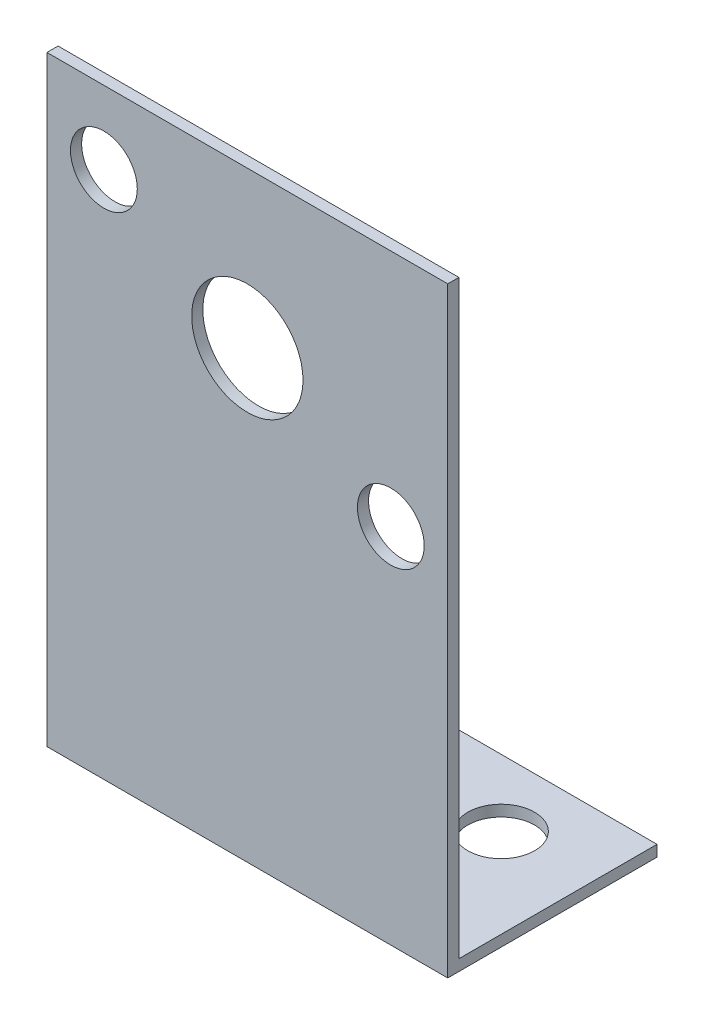
ISO-10303-21;
HEADER;
FILE_DESCRIPTION(('STEP AP214'),'2;1');
FILE_NAME('part.step','',(''),(''),'','','');
FILE_SCHEMA(('AUTOMOTIVE_DESIGN { 1 0 10303 214 1 1 1 1 }'));
ENDSEC;
DATA;
#1=APPLICATION_CONTEXT('core data for automotive mechanical design processes');
#2=APPLICATION_PROTOCOL_DEFINITION('international standard','automotive_design',2000,#1);
#3=PRODUCT_CONTEXT('',#1,'mechanical');
#4=PRODUCT('Part','Part','',(#3));
#5=PRODUCT_RELATED_PRODUCT_CATEGORY('part','',(#4));
#6=PRODUCT_DEFINITION_FORMATION('','',#4);
#7=PRODUCT_DEFINITION_CONTEXT('part definition',#1,'design');
#8=PRODUCT_DEFINITION('design','',#6,#7);
#9=PRODUCT_DEFINITION_SHAPE('','',#8);
#10=(LENGTH_UNIT() NAMED_UNIT(*) SI_UNIT(.MILLI.,.METRE.));
#11=(NAMED_UNIT(*) PLANE_ANGLE_UNIT() SI_UNIT($,.RADIAN.));
#12=(NAMED_UNIT(*) SI_UNIT($,.STERADIAN.) SOLID_ANGLE_UNIT());
#13=UNCERTAINTY_MEASURE_WITH_UNIT(LENGTH_MEASURE(1.E-05),#10,'distance_accuracy_value','');
#14=(GEOMETRIC_REPRESENTATION_CONTEXT(3) GLOBAL_UNCERTAINTY_ASSIGNED_CONTEXT((#13)) GLOBAL_UNIT_ASSIGNED_CONTEXT((#10,
#11,#12)) REPRESENTATION_CONTEXT('',''));
#15=CARTESIAN_POINT('',(0.,0.,0.));
#16=DIRECTION('',(0.,0.,1.));
#17=DIRECTION('',(1.,0.,0.));
#18=AXIS2_PLACEMENT_3D('',#15,#16,#17);
#19=CARTESIAN_POINT('',(-9.,-20.,0.));
#20=DIRECTION('',(0.,0.,1.));
#21=DIRECTION('',(1.,0.,0.));
#22=AXIS2_PLACEMENT_3D('',#19,#20,#21);
#23=PLANE('',#22);
#24=CARTESIAN_POINT('',(-6.44322900415622,3.72,0.));
#25=DIRECTION('',(0.,0.,-1.));
#26=DIRECTION('',(-1.,0.,0.));
#27=AXIS2_PLACEMENT_3D('',#24,#25,#26);
#28=CIRCLE('',#27,1.5);
#29=CARTESIAN_POINT('',(-7.94322900415622,3.72,0.));
#30=VERTEX_POINT('',#29);
#31=EDGE_CURVE('E206',#30,#30,#28,.T.);
#32=ORIENTED_EDGE('',*,*,#31,.F.);
#33=EDGE_LOOP('',(#32));
#34=FACE_BOUND('',#33,.T.);
#35=CARTESIAN_POINT('',(6.44322900415622,-3.72,0.));
#36=DIRECTION('',(0.,0.,-1.));
#37=DIRECTION('',(-1.,0.,0.));
#38=AXIS2_PLACEMENT_3D('',#35,#36,#37);
#39=CIRCLE('',#38,1.5);
#40=CARTESIAN_POINT('',(4.94322900415622,-3.72,0.));
#41=VERTEX_POINT('',#40);
#42=EDGE_CURVE('E200',#41,#41,#39,.T.);
#43=ORIENTED_EDGE('',*,*,#42,.F.);
#44=EDGE_LOOP('',(#43));
#45=FACE_BOUND('',#44,.T.);
#46=CARTESIAN_POINT('',(0.,0.,0.));
#47=DIRECTION('',(0.,0.,1.));
#48=DIRECTION('',(1.,0.,0.));
#49=AXIS2_PLACEMENT_3D('',#46,#47,#48);
#50=CIRCLE('',#49,2.5);
#51=CARTESIAN_POINT('',(2.5,0.,0.));
#52=VERTEX_POINT('',#51);
#53=EDGE_CURVE('E118',#52,#52,#50,.T.);
#54=ORIENTED_EDGE('',*,*,#53,.T.);
#55=EDGE_LOOP('',(#54));
#56=FACE_BOUND('',#55,.T.);
#57=DIRECTION('',(1.,0.,0.));
#58=VECTOR('',#57,1.);
#59=CARTESIAN_POINT('',(-9.,-19.5,0.));
#60=LINE('',#59,#58);
#61=CARTESIAN_POINT('',(-9.,-19.5,0.));
#62=VERTEX_POINT('',#61);
#63=CARTESIAN_POINT('',(9.,-19.5,0.));
#64=VERTEX_POINT('',#63);
#65=EDGE_CURVE('E49',#62,#64,#60,.T.);
#66=ORIENTED_EDGE('',*,*,#65,.F.);
#67=DIRECTION('',(0.,-1.,0.));
#68=VECTOR('',#67,1.);
#69=CARTESIAN_POINT('',(-9.,7.,0.));
#70=LINE('',#69,#68);
#71=CARTESIAN_POINT('',(-9.,7.,0.));
#72=VERTEX_POINT('',#71);
#73=EDGE_CURVE('E117',#72,#62,#70,.T.);
#74=ORIENTED_EDGE('',*,*,#73,.F.);
#75=DIRECTION('',(-1.,0.,0.));
#76=VECTOR('',#75,1.);
#77=CARTESIAN_POINT('',(-9.,7.,0.));
#78=LINE('',#77,#76);
#79=CARTESIAN_POINT('',(9.,7.,0.));
#80=VERTEX_POINT('',#79);
#81=EDGE_CURVE('E73',#80,#72,#78,.T.);
#82=ORIENTED_EDGE('',*,*,#81,.F.);
#83=DIRECTION('',(0.,1.,0.));
#84=VECTOR('',#83,1.);
#85=CARTESIAN_POINT('',(9.,7.,0.));
#86=LINE('',#85,#84);
#87=EDGE_CURVE('E129',#64,#80,#86,.T.);
#88=ORIENTED_EDGE('',*,*,#87,.F.);
#89=EDGE_LOOP('',(#66,#74,#82,#88));
#90=FACE_BOUND('',#89,.T.);
#91=ADVANCED_FACE('F32',(#34,#45,#56,#90),#23,.F.);
#92=CARTESIAN_POINT('',(-9.,-20.,0.5));
#93=DIRECTION('',(0.,0.,1.));
#94=DIRECTION('',(1.,0.,0.));
#95=AXIS2_PLACEMENT_3D('',#92,#93,#94);
#96=PLANE('',#95);
#97=CARTESIAN_POINT('',(-6.44322900415622,3.72,0.5));
#98=DIRECTION('',(0.,0.,1.));
#99=DIRECTION('',(1.,0.,0.));
#100=AXIS2_PLACEMENT_3D('',#97,#98,#99);
#101=CIRCLE('',#100,1.5);
#102=CARTESIAN_POINT('',(-4.94322900415622,3.72,0.5));
#103=VERTEX_POINT('',#102);
#104=EDGE_CURVE('E203',#103,#103,#101,.F.);
#105=ORIENTED_EDGE('',*,*,#104,.T.);
#106=EDGE_LOOP('',(#105));
#107=FACE_BOUND('',#106,.T.);
#108=CARTESIAN_POINT('',(6.44322900415622,-3.72,0.5));
#109=DIRECTION('',(0.,0.,1.));
#110=DIRECTION('',(1.,0.,0.));
#111=AXIS2_PLACEMENT_3D('',#108,#109,#110);
#112=CIRCLE('',#111,1.5);
#113=CARTESIAN_POINT('',(7.94322900415622,-3.72,0.5));
#114=VERTEX_POINT('',#113);
#115=EDGE_CURVE('E197',#114,#114,#112,.F.);
#116=ORIENTED_EDGE('',*,*,#115,.T.);
#117=EDGE_LOOP('',(#116));
#118=FACE_BOUND('',#117,.T.);
#119=DIRECTION('',(0.,-1.,0.));
#120=VECTOR('',#119,1.);
#121=CARTESIAN_POINT('',(-9.,7.,0.5));
#122=LINE('',#121,#120);
#123=CARTESIAN_POINT('',(-9.,7.,0.5));
#124=VERTEX_POINT('',#123);
#125=CARTESIAN_POINT('',(-9.,-20.,0.5));
#126=VERTEX_POINT('',#125);
#127=EDGE_CURVE('E138',#124,#126,#122,.T.);
#128=ORIENTED_EDGE('',*,*,#127,.T.);
#129=DIRECTION('',(1.,0.,0.));
#130=VECTOR('',#129,1.);
#131=CARTESIAN_POINT('',(-9.,-20.,0.5));
#132=LINE('',#131,#130);
#133=CARTESIAN_POINT('',(9.,-20.,0.5));
#134=VERTEX_POINT('',#133);
#135=EDGE_CURVE('E80',#126,#134,#132,.T.);
#136=ORIENTED_EDGE('',*,*,#135,.T.);
#137=DIRECTION('',(0.,1.,0.));
#138=VECTOR('',#137,1.);
#139=CARTESIAN_POINT('',(9.,7.,0.5));
#140=LINE('',#139,#138);
#141=CARTESIAN_POINT('',(9.,7.,0.5));
#142=VERTEX_POINT('',#141);
#143=EDGE_CURVE('E141',#134,#142,#140,.T.);
#144=ORIENTED_EDGE('',*,*,#143,.T.);
#145=DIRECTION('',(-1.,0.,0.));
#146=VECTOR('',#145,1.);
#147=CARTESIAN_POINT('',(-9.,7.,0.5));
#148=LINE('',#147,#146);
#149=EDGE_CURVE('E58',#142,#124,#148,.T.);
#150=ORIENTED_EDGE('',*,*,#149,.T.);
#151=EDGE_LOOP('',(#128,#136,#144,#150));
#152=FACE_BOUND('',#151,.T.);
#153=CARTESIAN_POINT('',(0.,0.,0.5));
#154=DIRECTION('',(0.,0.,1.));
#155=DIRECTION('',(1.,0.,0.));
#156=AXIS2_PLACEMENT_3D('',#153,#154,#155);
#157=CIRCLE('',#156,2.5);
#158=CARTESIAN_POINT('',(2.5,0.,0.5));
#159=VERTEX_POINT('',#158);
#160=EDGE_CURVE('E120',#159,#159,#157,.T.);
#161=ORIENTED_EDGE('',*,*,#160,.F.);
#162=EDGE_LOOP('',(#161));
#163=FACE_BOUND('',#162,.T.);
#164=ADVANCED_FACE('F158',(#107,#118,#152,#163),#96,.T.);
#165=CARTESIAN_POINT('',(-9.,7.,0.5));
#166=DIRECTION('',(1.,0.,0.));
#167=DIRECTION('',(0.,1.,0.));
#168=AXIS2_PLACEMENT_3D('',#165,#166,#167);
#169=PLANE('',#168);
#170=ORIENTED_EDGE('',*,*,#73,.T.);
#171=DIRECTION('',(0.,0.,1.));
#172=VECTOR('',#171,1.);
#173=CARTESIAN_POINT('',(-9.,-19.5,-8.9));
#174=LINE('',#173,#172);
#175=CARTESIAN_POINT('',(-9.,-19.5,-8.9));
#176=VERTEX_POINT('',#175);
#177=EDGE_CURVE('E100',#176,#62,#174,.T.);
#178=ORIENTED_EDGE('',*,*,#177,.F.);
#179=DIRECTION('',(0.,1.,0.));
#180=VECTOR('',#179,1.);
#181=CARTESIAN_POINT('',(-9.,-20.,-8.9));
#182=LINE('',#181,#180);
#183=CARTESIAN_POINT('',(-9.,-20.,-8.9));
#184=VERTEX_POINT('',#183);
#185=EDGE_CURVE('E107',#184,#176,#182,.T.);
#186=ORIENTED_EDGE('',*,*,#185,.F.);
#187=DIRECTION('',(0.,0.,-1.));
#188=VECTOR('',#187,1.);
#189=CARTESIAN_POINT('',(-9.,-20.,0.5));
#190=LINE('',#189,#188);
#191=EDGE_CURVE('E11',#126,#184,#190,.T.);
#192=ORIENTED_EDGE('',*,*,#191,.F.);
#193=ORIENTED_EDGE('',*,*,#127,.F.);
#194=DIRECTION('',(0.,0.,-1.));
#195=VECTOR('',#194,1.);
#196=CARTESIAN_POINT('',(-9.,7.,0.5));
#197=LINE('',#196,#195);
#198=EDGE_CURVE('E144',#124,#72,#197,.T.);
#199=ORIENTED_EDGE('',*,*,#198,.T.);
#200=EDGE_LOOP('',(#170,#178,#186,#192,#193,#199));
#201=FACE_BOUND('',#200,.T.);
#202=ADVANCED_FACE('F34',(#201),#169,.F.);
#203=CARTESIAN_POINT('',(-9.,-20.,0.5));
#204=DIRECTION('',(0.,1.,0.));
#205=DIRECTION('',(0.,0.,1.));
#206=AXIS2_PLACEMENT_3D('',#203,#204,#205);
#207=PLANE('',#206);
#208=CARTESIAN_POINT('',(5.,-20.,-5.9));
#209=DIRECTION('',(0.,1.,0.));
#210=DIRECTION('',(0.,0.,1.));
#211=AXIS2_PLACEMENT_3D('',#208,#209,#210);
#212=CIRCLE('',#211,1.5);
#213=CARTESIAN_POINT('',(5.,-20.,-4.4));
#214=VERTEX_POINT('',#213);
#215=EDGE_CURVE('E183',#214,#214,#212,.F.);
#216=ORIENTED_EDGE('',*,*,#215,.F.);
#217=EDGE_LOOP('',(#216));
#218=FACE_BOUND('',#217,.T.);
#219=CARTESIAN_POINT('',(-5.,-20.,-5.9));
#220=DIRECTION('',(0.,1.,0.));
#221=DIRECTION('',(0.,0.,1.));
#222=AXIS2_PLACEMENT_3D('',#219,#220,#221);
#223=CIRCLE('',#222,1.5);
#224=CARTESIAN_POINT('',(-5.,-20.,-4.4));
#225=VERTEX_POINT('',#224);
#226=EDGE_CURVE('E128',#225,#225,#223,.F.);
#227=ORIENTED_EDGE('',*,*,#226,.F.);
#228=EDGE_LOOP('',(#227));
#229=FACE_BOUND('',#228,.T.);
#230=ORIENTED_EDGE('',*,*,#191,.T.);
#231=DIRECTION('',(-1.,0.,0.));
#232=VECTOR('',#231,1.);
#233=CARTESIAN_POINT('',(-9.,-20.,-8.9));
#234=LINE('',#233,#232);
#235=CARTESIAN_POINT('',(9.,-20.,-8.9));
#236=VERTEX_POINT('',#235);
#237=EDGE_CURVE('E113',#236,#184,#234,.T.);
#238=ORIENTED_EDGE('',*,*,#237,.F.);
#239=DIRECTION('',(0.,0.,-1.));
#240=VECTOR('',#239,1.);
#241=CARTESIAN_POINT('',(9.,-20.,0.5));
#242=LINE('',#241,#240);
#243=EDGE_CURVE('E41',#134,#236,#242,.T.);
#244=ORIENTED_EDGE('',*,*,#243,.F.);
#245=ORIENTED_EDGE('',*,*,#135,.F.);
#246=EDGE_LOOP('',(#230,#238,#244,#245));
#247=FACE_BOUND('',#246,.T.);
#248=ADVANCED_FACE('F174',(#218,#229,#247),#207,.F.);
#249=CARTESIAN_POINT('',(9.,7.,0.5));
#250=DIRECTION('',(-1.,0.,0.));
#251=DIRECTION('',(0.,0.,1.));
#252=AXIS2_PLACEMENT_3D('',#249,#250,#251);
#253=PLANE('',#252);
#254=ORIENTED_EDGE('',*,*,#243,.T.);
#255=DIRECTION('',(0.,-1.,0.));
#256=VECTOR('',#255,1.);
#257=CARTESIAN_POINT('',(9.,-20.,-8.9));
#258=LINE('',#257,#256);
#259=CARTESIAN_POINT('',(9.,-19.5,-8.9));
#260=VERTEX_POINT('',#259);
#261=EDGE_CURVE('E106',#260,#236,#258,.T.);
#262=ORIENTED_EDGE('',*,*,#261,.F.);
#263=DIRECTION('',(0.,0.,1.));
#264=VECTOR('',#263,1.);
#265=CARTESIAN_POINT('',(9.,-19.5,-8.9));
#266=LINE('',#265,#264);
#267=EDGE_CURVE('E102',#260,#64,#266,.T.);
#268=ORIENTED_EDGE('',*,*,#267,.T.);
#269=ORIENTED_EDGE('',*,*,#87,.T.);
#270=DIRECTION('',(0.,0.,-1.));
#271=VECTOR('',#270,1.);
#272=CARTESIAN_POINT('',(9.,7.,0.5));
#273=LINE('',#272,#271);
#274=EDGE_CURVE('E150',#142,#80,#273,.T.);
#275=ORIENTED_EDGE('',*,*,#274,.F.);
#276=ORIENTED_EDGE('',*,*,#143,.F.);
#277=EDGE_LOOP('',(#254,#262,#268,#269,#275,#276));
#278=FACE_BOUND('',#277,.T.);
#279=ADVANCED_FACE('F154',(#278),#253,.F.);
#280=CARTESIAN_POINT('',(-9.,7.,0.5));
#281=DIRECTION('',(0.,-1.,0.));
#282=DIRECTION('',(0.,0.,-1.));
#283=AXIS2_PLACEMENT_3D('',#280,#281,#282);
#284=PLANE('',#283);
#285=ORIENTED_EDGE('',*,*,#81,.T.);
#286=ORIENTED_EDGE('',*,*,#198,.F.);
#287=ORIENTED_EDGE('',*,*,#149,.F.);
#288=ORIENTED_EDGE('',*,*,#274,.T.);
#289=EDGE_LOOP('',(#285,#286,#287,#288));
#290=FACE_BOUND('',#289,.T.);
#291=ADVANCED_FACE('F156',(#290),#284,.F.);
#292=CARTESIAN_POINT('',(0.,0.,0.5));
#293=DIRECTION('',(0.,0.,-1.));
#294=DIRECTION('',(-1.,0.,0.));
#295=AXIS2_PLACEMENT_3D('',#292,#293,#294);
#296=CYLINDRICAL_SURFACE('',#295,2.5);
#297=ORIENTED_EDGE('',*,*,#160,.T.);
#298=EDGE_LOOP('',(#297));
#299=FACE_BOUND('',#298,.T.);
#300=ORIENTED_EDGE('',*,*,#53,.F.);
#301=EDGE_LOOP('',(#300));
#302=FACE_BOUND('',#301,.T.);
#303=ADVANCED_FACE('F172',(#299,#302),#296,.F.);
#304=CARTESIAN_POINT('',(-9.,-19.5,-8.9));
#305=DIRECTION('',(0.,-1.,0.));
#306=DIRECTION('',(1.,0.,0.));
#307=AXIS2_PLACEMENT_3D('',#304,#305,#306);
#308=PLANE('',#307);
#309=CARTESIAN_POINT('',(5.,-19.5,-5.9));
#310=DIRECTION('',(0.,1.,0.));
#311=DIRECTION('',(-1.,0.,0.));
#312=AXIS2_PLACEMENT_3D('',#309,#310,#311);
#313=CIRCLE('',#312,1.5);
#314=CARTESIAN_POINT('',(3.5,-19.5,-5.9));
#315=VERTEX_POINT('',#314);
#316=EDGE_CURVE('E194',#315,#315,#313,.T.);
#317=ORIENTED_EDGE('',*,*,#316,.F.);
#318=EDGE_LOOP('',(#317));
#319=FACE_BOUND('',#318,.T.);
#320=CARTESIAN_POINT('',(-5.,-19.5,-5.9));
#321=DIRECTION('',(0.,1.,0.));
#322=DIRECTION('',(-1.,0.,0.));
#323=AXIS2_PLACEMENT_3D('',#320,#321,#322);
#324=CIRCLE('',#323,1.5);
#325=CARTESIAN_POINT('',(-6.5,-19.5,-5.9));
#326=VERTEX_POINT('',#325);
#327=EDGE_CURVE('E190',#326,#326,#324,.T.);
#328=ORIENTED_EDGE('',*,*,#327,.F.);
#329=EDGE_LOOP('',(#328));
#330=FACE_BOUND('',#329,.T.);
#331=ORIENTED_EDGE('',*,*,#65,.T.);
#332=ORIENTED_EDGE('',*,*,#267,.F.);
#333=DIRECTION('',(1.,0.,0.));
#334=VECTOR('',#333,1.);
#335=CARTESIAN_POINT('',(-9.,-19.5,-8.9));
#336=LINE('',#335,#334);
#337=EDGE_CURVE('E96',#176,#260,#336,.T.);
#338=ORIENTED_EDGE('',*,*,#337,.F.);
#339=ORIENTED_EDGE('',*,*,#177,.T.);
#340=EDGE_LOOP('',(#331,#332,#338,#339));
#341=FACE_BOUND('',#340,.T.);
#342=ADVANCED_FACE('F98',(#319,#330,#341),#308,.F.);
#343=CARTESIAN_POINT('',(-9.,-19.5,-8.9));
#344=DIRECTION('',(0.,0.,-1.));
#345=DIRECTION('',(-1.,0.,0.));
#346=AXIS2_PLACEMENT_3D('',#343,#344,#345);
#347=PLANE('',#346);
#348=ORIENTED_EDGE('',*,*,#185,.T.);
#349=ORIENTED_EDGE('',*,*,#337,.T.);
#350=ORIENTED_EDGE('',*,*,#261,.T.);
#351=ORIENTED_EDGE('',*,*,#237,.T.);
#352=EDGE_LOOP('',(#348,#349,#350,#351));
#353=FACE_BOUND('',#352,.T.);
#354=ADVANCED_FACE('F111',(#353),#347,.T.);
#355=CARTESIAN_POINT('',(-5.,-24.2426406871193,-5.9));
#356=DIRECTION('',(0.,1.,0.));
#357=DIRECTION('',(-1.,0.,0.));
#358=AXIS2_PLACEMENT_3D('',#355,#356,#357);
#359=CYLINDRICAL_SURFACE('',#358,1.5);
#360=ORIENTED_EDGE('',*,*,#226,.T.);
#361=EDGE_LOOP('',(#360));
#362=FACE_BOUND('',#361,.T.);
#363=ORIENTED_EDGE('',*,*,#327,.T.);
#364=EDGE_LOOP('',(#363));
#365=FACE_BOUND('',#364,.T.);
#366=ADVANCED_FACE('F225',(#362,#365),#359,.F.);
#367=CARTESIAN_POINT('',(5.,-24.2426406871193,-5.9));
#368=DIRECTION('',(0.,1.,0.));
#369=DIRECTION('',(-1.,0.,0.));
#370=AXIS2_PLACEMENT_3D('',#367,#368,#369);
#371=CYLINDRICAL_SURFACE('',#370,1.5);
#372=ORIENTED_EDGE('',*,*,#215,.T.);
#373=EDGE_LOOP('',(#372));
#374=FACE_BOUND('',#373,.T.);
#375=ORIENTED_EDGE('',*,*,#316,.T.);
#376=EDGE_LOOP('',(#375));
#377=FACE_BOUND('',#376,.T.);
#378=ADVANCED_FACE('F219',(#374,#377),#371,.F.);
#379=CARTESIAN_POINT('',(6.44322900415622,-3.72,4.74264068711928));
#380=DIRECTION('',(0.,0.,-1.));
#381=DIRECTION('',(-1.,0.,0.));
#382=AXIS2_PLACEMENT_3D('',#379,#380,#381);
#383=CYLINDRICAL_SURFACE('',#382,1.5);
#384=ORIENTED_EDGE('',*,*,#42,.T.);
#385=EDGE_LOOP('',(#384));
#386=FACE_BOUND('',#385,.T.);
#387=ORIENTED_EDGE('',*,*,#115,.F.);
#388=EDGE_LOOP('',(#387));
#389=FACE_BOUND('',#388,.T.);
#390=ADVANCED_FACE('F212',(#386,#389),#383,.F.);
#391=CARTESIAN_POINT('',(-6.44322900415622,3.72,4.74264068711928));
#392=DIRECTION('',(0.,0.,-1.));
#393=DIRECTION('',(-1.,0.,0.));
#394=AXIS2_PLACEMENT_3D('',#391,#392,#393);
#395=CYLINDRICAL_SURFACE('',#394,1.5);
#396=ORIENTED_EDGE('',*,*,#31,.T.);
#397=EDGE_LOOP('',(#396));
#398=FACE_BOUND('',#397,.T.);
#399=ORIENTED_EDGE('',*,*,#104,.F.);
#400=EDGE_LOOP('',(#399));
#401=FACE_BOUND('',#400,.T.);
#402=ADVANCED_FACE('F209',(#398,#401),#395,.F.);
#403=CLOSED_SHELL('',(#91,#164,#202,#248,#279,#291,#303,#342,#354,#366,#378,#390,#402));
#404=MANIFOLD_SOLID_BREP('B2',#403);
#405=ADVANCED_BREP_SHAPE_REPRESENTATION('',(#18,#404),#14);
#406=SHAPE_DEFINITION_REPRESENTATION(#9,#405);
ENDSEC;
END-ISO-10303-21;
